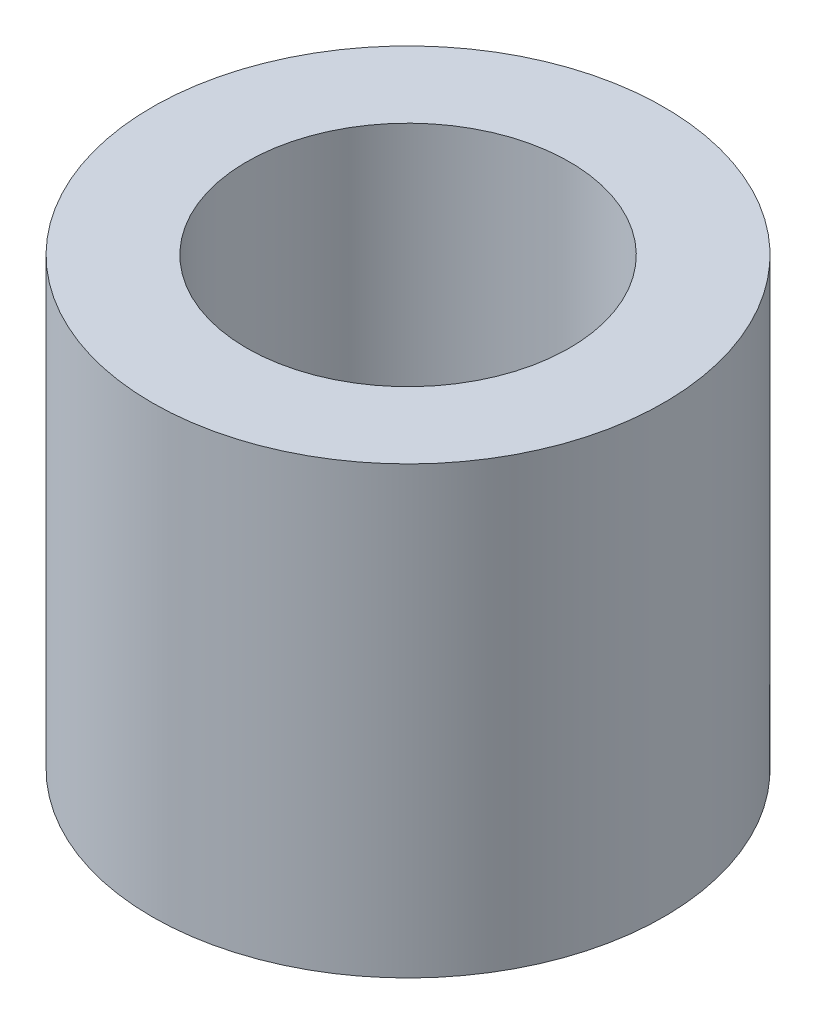
ISO-10303-21;
HEADER;
FILE_DESCRIPTION(('STEP AP214'),'2;1');
FILE_NAME('part.step','',(''),(''),'','','');
FILE_SCHEMA(('AUTOMOTIVE_DESIGN { 1 0 10303 214 1 1 1 1 }'));
ENDSEC;
DATA;
#1=APPLICATION_CONTEXT('core data for automotive mechanical design processes');
#2=APPLICATION_PROTOCOL_DEFINITION('international standard','automotive_design',2000,#1);
#3=PRODUCT_CONTEXT('',#1,'mechanical');
#4=PRODUCT('Part','Part','',(#3));
#5=PRODUCT_RELATED_PRODUCT_CATEGORY('part','',(#4));
#6=PRODUCT_DEFINITION_FORMATION('','',#4);
#7=PRODUCT_DEFINITION_CONTEXT('part definition',#1,'design');
#8=PRODUCT_DEFINITION('design','',#6,#7);
#9=PRODUCT_DEFINITION_SHAPE('','',#8);
#10=(LENGTH_UNIT() NAMED_UNIT(*) SI_UNIT(.MILLI.,.METRE.));
#11=(NAMED_UNIT(*) PLANE_ANGLE_UNIT() SI_UNIT($,.RADIAN.));
#12=(NAMED_UNIT(*) SI_UNIT($,.STERADIAN.) SOLID_ANGLE_UNIT());
#13=UNCERTAINTY_MEASURE_WITH_UNIT(LENGTH_MEASURE(1.E-05),#10,'distance_accuracy_value','');
#14=(GEOMETRIC_REPRESENTATION_CONTEXT(3) GLOBAL_UNCERTAINTY_ASSIGNED_CONTEXT((#13)) GLOBAL_UNIT_ASSIGNED_CONTEXT((#10,
#11,#12)) REPRESENTATION_CONTEXT('',''));
#15=CARTESIAN_POINT('',(0.,0.,0.));
#16=DIRECTION('',(0.,0.,1.));
#17=DIRECTION('',(1.,0.,0.));
#18=AXIS2_PLACEMENT_3D('',#15,#16,#17);
#19=CARTESIAN_POINT('',(0.,400.,0.));
#20=DIRECTION('',(0.,1.,0.));
#21=DIRECTION('',(0.,0.,1.));
#22=AXIS2_PLACEMENT_3D('',#19,#20,#21);
#23=PLANE('',#22);
#24=CARTESIAN_POINT('',(0.,400.,0.));
#25=DIRECTION('',(0.,1.,0.));
#26=DIRECTION('',(0.,0.,1.));
#27=AXIS2_PLACEMENT_3D('',#24,#25,#26);
#28=CIRCLE('',#27,230.);
#29=CARTESIAN_POINT('',(0.,400.,230.));
#30=VERTEX_POINT('',#29);
#31=EDGE_CURVE('E10',#30,#30,#28,.T.);
#32=ORIENTED_EDGE('',*,*,#31,.T.);
#33=EDGE_LOOP('',(#32));
#34=FACE_BOUND('',#33,.T.);
#35=CARTESIAN_POINT('',(0.,400.,0.));
#36=DIRECTION('',(0.,1.,0.));
#37=DIRECTION('',(0.,0.,1.));
#38=AXIS2_PLACEMENT_3D('',#35,#36,#37);
#39=CIRCLE('',#38,145.);
#40=CARTESIAN_POINT('',(0.,400.,145.));
#41=VERTEX_POINT('',#40);
#42=EDGE_CURVE('E43',#41,#41,#39,.T.);
#43=ORIENTED_EDGE('',*,*,#42,.F.);
#44=EDGE_LOOP('',(#43));
#45=FACE_BOUND('',#44,.T.);
#46=ADVANCED_FACE('F32',(#34,#45),#23,.T.);
#47=CARTESIAN_POINT('',(0.,0.,0.));
#48=DIRECTION('',(0.,1.,0.));
#49=DIRECTION('',(0.,0.,1.));
#50=AXIS2_PLACEMENT_3D('',#47,#48,#49);
#51=PLANE('',#50);
#52=CARTESIAN_POINT('',(0.,0.,0.));
#53=DIRECTION('',(0.,1.,0.));
#54=DIRECTION('',(0.,0.,1.));
#55=AXIS2_PLACEMENT_3D('',#52,#53,#54);
#56=CIRCLE('',#55,230.);
#57=CARTESIAN_POINT('',(0.,0.,230.));
#58=VERTEX_POINT('',#57);
#59=EDGE_CURVE('E36',#58,#58,#56,.T.);
#60=ORIENTED_EDGE('',*,*,#59,.F.);
#61=EDGE_LOOP('',(#60));
#62=FACE_BOUND('',#61,.T.);
#63=CARTESIAN_POINT('',(0.,0.,0.));
#64=DIRECTION('',(0.,1.,0.));
#65=DIRECTION('',(0.,0.,1.));
#66=AXIS2_PLACEMENT_3D('',#63,#64,#65);
#67=CIRCLE('',#66,145.);
#68=CARTESIAN_POINT('',(0.,0.,145.));
#69=VERTEX_POINT('',#68);
#70=EDGE_CURVE('E45',#69,#69,#67,.T.);
#71=ORIENTED_EDGE('',*,*,#70,.T.);
#72=EDGE_LOOP('',(#71));
#73=FACE_BOUND('',#72,.T.);
#74=ADVANCED_FACE('F55',(#62,#73),#51,.F.);
#75=CARTESIAN_POINT('',(0.,400.,0.));
#76=DIRECTION('',(0.,-1.,0.));
#77=DIRECTION('',(0.,0.,-1.));
#78=AXIS2_PLACEMENT_3D('',#75,#76,#77);
#79=CYLINDRICAL_SURFACE('',#78,230.);
#80=ORIENTED_EDGE('',*,*,#31,.F.);
#81=EDGE_LOOP('',(#80));
#82=FACE_BOUND('',#81,.T.);
#83=ORIENTED_EDGE('',*,*,#59,.T.);
#84=EDGE_LOOP('',(#83));
#85=FACE_BOUND('',#84,.T.);
#86=ADVANCED_FACE('F34',(#82,#85),#79,.T.);
#87=CARTESIAN_POINT('',(0.,400.,0.));
#88=DIRECTION('',(0.,-1.,0.));
#89=DIRECTION('',(0.,0.,-1.));
#90=AXIS2_PLACEMENT_3D('',#87,#88,#89);
#91=CYLINDRICAL_SURFACE('',#90,145.);
#92=ORIENTED_EDGE('',*,*,#42,.T.);
#93=EDGE_LOOP('',(#92));
#94=FACE_BOUND('',#93,.T.);
#95=ORIENTED_EDGE('',*,*,#70,.F.);
#96=EDGE_LOOP('',(#95));
#97=FACE_BOUND('',#96,.T.);
#98=ADVANCED_FACE('F51',(#94,#97),#91,.F.);
#99=CLOSED_SHELL('',(#46,#74,#86,#98));
#100=MANIFOLD_SOLID_BREP('B2',#99);
#101=ADVANCED_BREP_SHAPE_REPRESENTATION('',(#18,#100),#14);
#102=SHAPE_DEFINITION_REPRESENTATION(#9,#101);
ENDSEC;
END-ISO-10303-21;
